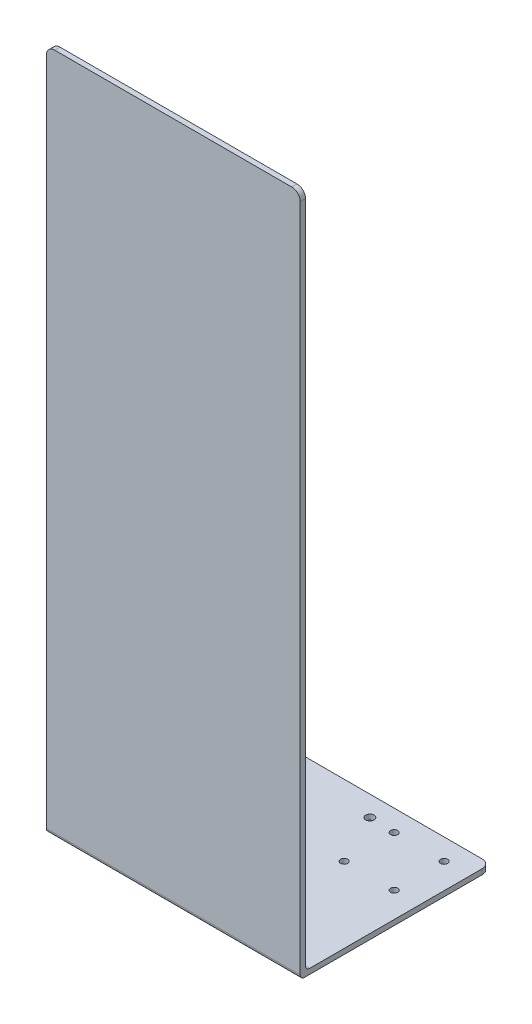
ISO-10303-21;
HEADER;
FILE_DESCRIPTION(('STEP AP214'),'2;1');
FILE_NAME('part.step','',(''),(''),'','','');
FILE_SCHEMA(('AUTOMOTIVE_DESIGN { 1 0 10303 214 1 1 1 1 }'));
ENDSEC;
DATA;
#1=APPLICATION_CONTEXT('core data for automotive mechanical design processes');
#2=APPLICATION_PROTOCOL_DEFINITION('international standard','automotive_design',2000,#1);
#3=PRODUCT_CONTEXT('',#1,'mechanical');
#4=PRODUCT('Part','Part','',(#3));
#5=PRODUCT_RELATED_PRODUCT_CATEGORY('part','',(#4));
#6=PRODUCT_DEFINITION_FORMATION('','',#4);
#7=PRODUCT_DEFINITION_CONTEXT('part definition',#1,'design');
#8=PRODUCT_DEFINITION('design','',#6,#7);
#9=PRODUCT_DEFINITION_SHAPE('','',#8);
#10=(LENGTH_UNIT() NAMED_UNIT(*) SI_UNIT(.MILLI.,.METRE.));
#11=(NAMED_UNIT(*) PLANE_ANGLE_UNIT() SI_UNIT($,.RADIAN.));
#12=(NAMED_UNIT(*) SI_UNIT($,.STERADIAN.) SOLID_ANGLE_UNIT());
#13=UNCERTAINTY_MEASURE_WITH_UNIT(LENGTH_MEASURE(1.E-05),#10,'distance_accuracy_value','');
#14=(GEOMETRIC_REPRESENTATION_CONTEXT(3) GLOBAL_UNCERTAINTY_ASSIGNED_CONTEXT((#13)) GLOBAL_UNIT_ASSIGNED_CONTEXT((#10,
#11,#12)) REPRESENTATION_CONTEXT('',''));
#15=CARTESIAN_POINT('',(0.,0.,0.));
#16=DIRECTION('',(0.,0.,1.));
#17=DIRECTION('',(1.,0.,0.));
#18=AXIS2_PLACEMENT_3D('',#15,#16,#17);
#19=CARTESIAN_POINT('',(-76.2,3.175,57.15));
#20=DIRECTION('',(1.,0.,0.));
#21=DIRECTION('',(0.,0.,-1.));
#22=AXIS2_PLACEMENT_3D('',#19,#20,#21);
#23=PLANE('',#22);
#24=DIRECTION('',(0.,-1.,0.));
#25=VECTOR('',#24,1.);
#26=CARTESIAN_POINT('',(-76.2,3.175,57.15));
#27=LINE('',#26,#25);
#28=CARTESIAN_POINT('',(-76.2,404.495,57.15));
#29=VERTEX_POINT('',#28);
#30=CARTESIAN_POINT('',(-76.2,2.54,57.15));
#31=VERTEX_POINT('',#30);
#32=EDGE_CURVE('E149',#29,#31,#27,.T.);
#33=ORIENTED_EDGE('',*,*,#32,.F.);
#34=DIRECTION('',(0.,0.,1.));
#35=VECTOR('',#34,1.);
#36=CARTESIAN_POINT('',(-76.2,404.495,57.15));
#37=LINE('',#36,#35);
#38=CARTESIAN_POINT('',(-76.2,404.495,53.975));
#39=VERTEX_POINT('',#38);
#40=EDGE_CURVE('E130',#29,#39,#37,.F.);
#41=ORIENTED_EDGE('',*,*,#40,.T.);
#42=DIRECTION('',(0.,-1.,0.));
#43=VECTOR('',#42,1.);
#44=CARTESIAN_POINT('',(-76.2,409.575,53.975));
#45=LINE('',#44,#43);
#46=CARTESIAN_POINT('',(-76.2,5.71500000000003,53.975));
#47=VERTEX_POINT('',#46);
#48=EDGE_CURVE('E123',#39,#47,#45,.T.);
#49=ORIENTED_EDGE('',*,*,#48,.T.);
#50=CARTESIAN_POINT('',(-76.2,5.71500000000003,51.435));
#51=DIRECTION('',(1.,0.,0.));
#52=DIRECTION('',(0.,0.,-1.));
#53=AXIS2_PLACEMENT_3D('',#50,#51,#52);
#54=CIRCLE('',#53,2.54);
#55=CARTESIAN_POINT('',(-76.2,3.175,51.435));
#56=VERTEX_POINT('',#55);
#57=EDGE_CURVE('E127',#47,#56,#54,.T.);
#58=ORIENTED_EDGE('',*,*,#57,.T.);
#59=DIRECTION('',(0.,0.,1.));
#60=VECTOR('',#59,1.);
#61=CARTESIAN_POINT('',(-76.2,3.175,57.15));
#62=LINE('',#61,#60);
#63=CARTESIAN_POINT('',(-76.2,3.175,-52.07));
#64=VERTEX_POINT('',#63);
#65=EDGE_CURVE('E207',#64,#56,#62,.T.);
#66=ORIENTED_EDGE('',*,*,#65,.F.);
#67=DIRECTION('',(0.,-1.,0.));
#68=VECTOR('',#67,1.);
#69=CARTESIAN_POINT('',(-76.2,3.175,-52.07));
#70=LINE('',#69,#68);
#71=CARTESIAN_POINT('',(-76.2,0.,-52.07));
#72=VERTEX_POINT('',#71);
#73=EDGE_CURVE('E177',#64,#72,#70,.T.);
#74=ORIENTED_EDGE('',*,*,#73,.T.);
#75=DIRECTION('',(0.,0.,1.));
#76=VECTOR('',#75,1.);
#77=CARTESIAN_POINT('',(-76.2,0.,57.15));
#78=LINE('',#77,#76);
#79=CARTESIAN_POINT('',(-76.2,0.,54.61));
#80=VERTEX_POINT('',#79);
#81=EDGE_CURVE('E212',#72,#80,#78,.T.);
#82=ORIENTED_EDGE('',*,*,#81,.T.);
#83=CARTESIAN_POINT('',(-76.2,2.54,54.61));
#84=DIRECTION('',(1.,0.,0.));
#85=DIRECTION('',(0.,0.,-1.));
#86=AXIS2_PLACEMENT_3D('',#83,#84,#85);
#87=CIRCLE('',#86,2.54);
#88=EDGE_CURVE('E144',#80,#31,#87,.F.);
#89=ORIENTED_EDGE('',*,*,#88,.T.);
#90=EDGE_LOOP('',(#33,#41,#49,#58,#66,#74,#82,#89));
#91=FACE_BOUND('',#90,.T.);
#92=ADVANCED_FACE('F34',(#91),#23,.F.);
#93=CARTESIAN_POINT('',(76.2,3.175,57.15));
#94=DIRECTION('',(0.,0.,-1.));
#95=DIRECTION('',(-1.,0.,0.));
#96=AXIS2_PLACEMENT_3D('',#93,#94,#95);
#97=PLANE('',#96);
#98=DIRECTION('',(1.,0.,0.));
#99=VECTOR('',#98,1.);
#100=CARTESIAN_POINT('',(-76.2,409.575,57.15));
#101=LINE('',#100,#99);
#102=CARTESIAN_POINT('',(-71.12,409.575,57.15));
#103=VERTEX_POINT('',#102);
#104=CARTESIAN_POINT('',(71.1199999999999,409.575,57.15));
#105=VERTEX_POINT('',#104);
#106=EDGE_CURVE('E225',#103,#105,#101,.T.);
#107=ORIENTED_EDGE('',*,*,#106,.F.);
#108=CARTESIAN_POINT('',(-71.12,404.495,57.15));
#109=DIRECTION('',(0.,0.,-1.));
#110=DIRECTION('',(-1.,0.,0.));
#111=AXIS2_PLACEMENT_3D('',#108,#109,#110);
#112=CIRCLE('',#111,5.08);
#113=EDGE_CURVE('E175',#103,#29,#112,.F.);
#114=ORIENTED_EDGE('',*,*,#113,.T.);
#115=ORIENTED_EDGE('',*,*,#32,.T.);
#116=DIRECTION('',(1.,0.,0.));
#117=VECTOR('',#116,1.);
#118=CARTESIAN_POINT('',(76.2,2.54,57.15));
#119=LINE('',#118,#117);
#120=CARTESIAN_POINT('',(76.2,2.54,57.15));
#121=VERTEX_POINT('',#120);
#122=EDGE_CURVE('E151',#31,#121,#119,.T.);
#123=ORIENTED_EDGE('',*,*,#122,.T.);
#124=DIRECTION('',(0.,-1.,0.));
#125=VECTOR('',#124,1.);
#126=CARTESIAN_POINT('',(76.2,3.175,57.15));
#127=LINE('',#126,#125);
#128=CARTESIAN_POINT('',(76.2,404.495,57.15));
#129=VERTEX_POINT('',#128);
#130=EDGE_CURVE('E153',#129,#121,#127,.T.);
#131=ORIENTED_EDGE('',*,*,#130,.F.);
#132=CARTESIAN_POINT('',(71.12,404.495,57.15));
#133=DIRECTION('',(0.,0.,-1.));
#134=DIRECTION('',(-1.,0.,0.));
#135=AXIS2_PLACEMENT_3D('',#132,#133,#134);
#136=CIRCLE('',#135,5.08);
#137=EDGE_CURVE('E173',#129,#105,#136,.F.);
#138=ORIENTED_EDGE('',*,*,#137,.T.);
#139=EDGE_LOOP('',(#107,#114,#115,#123,#131,#138));
#140=FACE_BOUND('',#139,.T.);
#141=ADVANCED_FACE('F323',(#140),#97,.F.);
#142=CARTESIAN_POINT('',(76.2,3.175,57.15));
#143=DIRECTION('',(-1.,0.,0.));
#144=DIRECTION('',(0.,0.,1.));
#145=AXIS2_PLACEMENT_3D('',#142,#143,#144);
#146=PLANE('',#145);
#147=DIRECTION('',(0.,-1.,0.));
#148=VECTOR('',#147,1.);
#149=CARTESIAN_POINT('',(76.2,409.575,53.975));
#150=LINE('',#149,#148);
#151=CARTESIAN_POINT('',(76.2,404.495,53.975));
#152=VERTEX_POINT('',#151);
#153=CARTESIAN_POINT('',(76.2,5.71500000000003,53.975));
#154=VERTEX_POINT('',#153);
#155=EDGE_CURVE('E134',#152,#154,#150,.T.);
#156=ORIENTED_EDGE('',*,*,#155,.F.);
#157=DIRECTION('',(0.,0.,-1.));
#158=VECTOR('',#157,1.);
#159=CARTESIAN_POINT('',(76.2,404.495,57.15));
#160=LINE('',#159,#158);
#161=EDGE_CURVE('E187',#152,#129,#160,.F.);
#162=ORIENTED_EDGE('',*,*,#161,.T.);
#163=ORIENTED_EDGE('',*,*,#130,.T.);
#164=CARTESIAN_POINT('',(76.2,2.54,54.61));
#165=DIRECTION('',(-1.,0.,0.));
#166=DIRECTION('',(0.,0.,1.));
#167=AXIS2_PLACEMENT_3D('',#164,#165,#166);
#168=CIRCLE('',#167,2.54);
#169=CARTESIAN_POINT('',(76.2,0.,54.61));
#170=VERTEX_POINT('',#169);
#171=EDGE_CURVE('E159',#121,#170,#168,.F.);
#172=ORIENTED_EDGE('',*,*,#171,.T.);
#173=DIRECTION('',(0.,0.,-1.));
#174=VECTOR('',#173,1.);
#175=CARTESIAN_POINT('',(76.2,0.,57.15));
#176=LINE('',#175,#174);
#177=CARTESIAN_POINT('',(76.2,0.,-52.07));
#178=VERTEX_POINT('',#177);
#179=EDGE_CURVE('E208',#170,#178,#176,.T.);
#180=ORIENTED_EDGE('',*,*,#179,.T.);
#181=DIRECTION('',(0.,-1.,0.));
#182=VECTOR('',#181,1.);
#183=CARTESIAN_POINT('',(76.2,3.175,-52.07));
#184=LINE('',#183,#182);
#185=CARTESIAN_POINT('',(76.2,3.175,-52.07));
#186=VERTEX_POINT('',#185);
#187=EDGE_CURVE('E185',#178,#186,#184,.F.);
#188=ORIENTED_EDGE('',*,*,#187,.T.);
#189=DIRECTION('',(0.,0.,-1.));
#190=VECTOR('',#189,1.);
#191=CARTESIAN_POINT('',(76.2,3.175,57.15));
#192=LINE('',#191,#190);
#193=CARTESIAN_POINT('',(76.2,3.175,51.435));
#194=VERTEX_POINT('',#193);
#195=EDGE_CURVE('E210',#194,#186,#192,.T.);
#196=ORIENTED_EDGE('',*,*,#195,.F.);
#197=CARTESIAN_POINT('',(76.2,5.71500000000003,51.435));
#198=DIRECTION('',(-1.,0.,0.));
#199=DIRECTION('',(0.,0.,1.));
#200=AXIS2_PLACEMENT_3D('',#197,#198,#199);
#201=CIRCLE('',#200,2.54);
#202=EDGE_CURVE('E143',#194,#154,#201,.T.);
#203=ORIENTED_EDGE('',*,*,#202,.T.);
#204=EDGE_LOOP('',(#156,#162,#163,#172,#180,#188,#196,#203));
#205=FACE_BOUND('',#204,.T.);
#206=ADVANCED_FACE('F329',(#205),#146,.F.);
#207=CARTESIAN_POINT('',(76.2,3.175,-57.15));
#208=DIRECTION('',(0.,0.,1.));
#209=DIRECTION('',(1.,0.,0.));
#210=AXIS2_PLACEMENT_3D('',#207,#208,#209);
#211=PLANE('',#210);
#212=DIRECTION('',(-1.,0.,0.));
#213=VECTOR('',#212,1.);
#214=CARTESIAN_POINT('',(76.2,0.,-57.15));
#215=LINE('',#214,#213);
#216=CARTESIAN_POINT('',(71.12,0.,-57.15));
#217=VERTEX_POINT('',#216);
#218=CARTESIAN_POINT('',(-71.12,0.,-57.15));
#219=VERTEX_POINT('',#218);
#220=EDGE_CURVE('E199',#217,#219,#215,.T.);
#221=ORIENTED_EDGE('',*,*,#220,.T.);
#222=DIRECTION('',(0.,-1.,0.));
#223=VECTOR('',#222,1.);
#224=CARTESIAN_POINT('',(-71.12,3.175,-57.15));
#225=LINE('',#224,#223);
#226=CARTESIAN_POINT('',(-71.12,3.175,-57.15));
#227=VERTEX_POINT('',#226);
#228=EDGE_CURVE('E49',#219,#227,#225,.F.);
#229=ORIENTED_EDGE('',*,*,#228,.T.);
#230=DIRECTION('',(-1.,0.,0.));
#231=VECTOR('',#230,1.);
#232=CARTESIAN_POINT('',(76.2,3.175,-57.15));
#233=LINE('',#232,#231);
#234=CARTESIAN_POINT('',(71.12,3.175,-57.15));
#235=VERTEX_POINT('',#234);
#236=EDGE_CURVE('E200',#235,#227,#233,.T.);
#237=ORIENTED_EDGE('',*,*,#236,.F.);
#238=DIRECTION('',(0.,-1.,0.));
#239=VECTOR('',#238,1.);
#240=CARTESIAN_POINT('',(71.12,3.175,-57.15));
#241=LINE('',#240,#239);
#242=EDGE_CURVE('E193',#235,#217,#241,.T.);
#243=ORIENTED_EDGE('',*,*,#242,.T.);
#244=EDGE_LOOP('',(#221,#229,#237,#243));
#245=FACE_BOUND('',#244,.T.);
#246=ADVANCED_FACE('F198',(#245),#211,.F.);
#247=CARTESIAN_POINT('',(0.,3.175,0.));
#248=DIRECTION('',(0.,1.,0.));
#249=DIRECTION('',(0.,0.,1.));
#250=AXIS2_PLACEMENT_3D('',#247,#248,#249);
#251=PLANE('',#250);
#252=CARTESIAN_POINT('',(30.9880000000026,3.17500000000537,-44.45));
#253=DIRECTION('',(0.,1.,0.));
#254=DIRECTION('',(0.,0.,1.));
#255=AXIS2_PLACEMENT_3D('',#252,#253,#254);
#256=CIRCLE('',#255,2.159);
#257=CARTESIAN_POINT('',(30.9880000000026,3.17500000000537,-42.291));
#258=VERTEX_POINT('',#257);
#259=EDGE_CURVE('E247',#258,#258,#256,.T.);
#260=ORIENTED_EDGE('',*,*,#259,.F.);
#261=EDGE_LOOP('',(#260));
#262=FACE_BOUND('',#261,.T.);
#263=CARTESIAN_POINT('',(15.8749999999996,3.17500000000137,37.465));
#264=DIRECTION('',(0.,1.,0.));
#265=DIRECTION('',(0.,0.,1.));
#266=AXIS2_PLACEMENT_3D('',#263,#264,#265);
#267=CIRCLE('',#266,2.54);
#268=CARTESIAN_POINT('',(15.8749999999996,3.17500000000137,40.005));
#269=VERTEX_POINT('',#268);
#270=EDGE_CURVE('E254',#269,#269,#267,.T.);
#271=ORIENTED_EDGE('',*,*,#270,.F.);
#272=EDGE_LOOP('',(#271));
#273=FACE_BOUND('',#272,.T.);
#274=CARTESIAN_POINT('',(-66.6750000000018,3.17500000000914,37.465));
#275=DIRECTION('',(0.,1.,0.));
#276=DIRECTION('',(0.,0.,1.));
#277=AXIS2_PLACEMENT_3D('',#274,#275,#276);
#278=CIRCLE('',#277,2.54000000000001);
#279=CARTESIAN_POINT('',(-66.6750000000018,3.17500000000914,40.005));
#280=VERTEX_POINT('',#279);
#281=EDGE_CURVE('E235',#280,#280,#278,.T.);
#282=ORIENTED_EDGE('',*,*,#281,.F.);
#283=EDGE_LOOP('',(#282));
#284=FACE_BOUND('',#283,.T.);
#285=CARTESIAN_POINT('',(15.8749999999995,3.17500000000387,-44.958));
#286=DIRECTION('',(0.,1.,0.));
#287=DIRECTION('',(0.,0.,1.));
#288=AXIS2_PLACEMENT_3D('',#285,#286,#287);
#289=CIRCLE('',#288,2.54);
#290=CARTESIAN_POINT('',(15.8749999999995,3.17500000000387,-42.418));
#291=VERTEX_POINT('',#290);
#292=EDGE_CURVE('E242',#291,#291,#289,.T.);
#293=ORIENTED_EDGE('',*,*,#292,.F.);
#294=EDGE_LOOP('',(#293));
#295=FACE_BOUND('',#294,.T.);
#296=CARTESIAN_POINT('',(60.9386025101175,3.17500000000739,-44.4600000000001));
#297=DIRECTION('',(0.,1.,0.));
#298=DIRECTION('',(0.,0.,1.));
#299=AXIS2_PLACEMENT_3D('',#296,#297,#298);
#300=CIRCLE('',#299,2.14999999999998);
#301=CARTESIAN_POINT('',(60.9386025101175,3.17500000000739,-42.3100000000001));
#302=VERTEX_POINT('',#301);
#303=EDGE_CURVE('E277',#302,#302,#300,.T.);
#304=ORIENTED_EDGE('',*,*,#303,.F.);
#305=EDGE_LOOP('',(#304));
#306=FACE_BOUND('',#305,.T.);
#307=CARTESIAN_POINT('',(60.9600000000001,3.17500000000201,-14.4780000000097));
#308=DIRECTION('',(0.,1.,0.));
#309=DIRECTION('',(0.,0.,1.));
#310=AXIS2_PLACEMENT_3D('',#307,#308,#309);
#311=CIRCLE('',#310,2.15899999999999);
#312=CARTESIAN_POINT('',(60.9600000000001,3.17500000000201,-12.3190000000097));
#313=VERTEX_POINT('',#312);
#314=EDGE_CURVE('E271',#313,#313,#311,.T.);
#315=ORIENTED_EDGE('',*,*,#314,.F.);
#316=EDGE_LOOP('',(#315));
#317=FACE_BOUND('',#316,.T.);
#318=CARTESIAN_POINT('',(30.938602510105,3.1750000000029,-14.478));
#319=DIRECTION('',(0.,1.,0.));
#320=DIRECTION('',(0.,0.,1.));
#321=AXIS2_PLACEMENT_3D('',#318,#319,#320);
#322=CIRCLE('',#321,2.159);
#323=CARTESIAN_POINT('',(30.938602510105,3.1750000000029,-12.319));
#324=VERTEX_POINT('',#323);
#325=EDGE_CURVE('E265',#324,#324,#322,.T.);
#326=ORIENTED_EDGE('',*,*,#325,.F.);
#327=EDGE_LOOP('',(#326));
#328=FACE_BOUND('',#327,.T.);
#329=CARTESIAN_POINT('',(-66.6750000000005,3.17500000000326,-45.085));
#330=DIRECTION('',(0.,1.,0.));
#331=DIRECTION('',(0.,0.,1.));
#332=AXIS2_PLACEMENT_3D('',#329,#330,#331);
#333=CIRCLE('',#332,2.53999999999998);
#334=CARTESIAN_POINT('',(-66.6750000000005,3.17500000000326,-42.545));
#335=VERTEX_POINT('',#334);
#336=EDGE_CURVE('E259',#335,#335,#333,.T.);
#337=ORIENTED_EDGE('',*,*,#336,.F.);
#338=EDGE_LOOP('',(#337));
#339=FACE_BOUND('',#338,.T.);
#340=CARTESIAN_POINT('',(-25.4,3.17500000000104,-3.80999999999998));
#341=DIRECTION('',(0.,1.,0.));
#342=DIRECTION('',(0.,0.,1.));
#343=AXIS2_PLACEMENT_3D('',#340,#341,#342);
#344=CIRCLE('',#343,30.988);
#345=CARTESIAN_POINT('',(-25.4,3.17500000000104,27.178));
#346=VERTEX_POINT('',#345);
#347=EDGE_CURVE('E229',#346,#346,#344,.T.);
#348=ORIENTED_EDGE('',*,*,#347,.F.);
#349=EDGE_LOOP('',(#348));
#350=FACE_BOUND('',#349,.T.);
#351=ORIENTED_EDGE('',*,*,#236,.T.);
#352=CARTESIAN_POINT('',(-71.12,3.175,-52.07));
#353=DIRECTION('',(0.,1.,0.));
#354=DIRECTION('',(0.,0.,1.));
#355=AXIS2_PLACEMENT_3D('',#352,#353,#354);
#356=CIRCLE('',#355,5.08);
#357=EDGE_CURVE('E11',#227,#64,#356,.T.);
#358=ORIENTED_EDGE('',*,*,#357,.T.);
#359=ORIENTED_EDGE('',*,*,#65,.T.);
#360=DIRECTION('',(-1.,0.,0.));
#361=VECTOR('',#360,1.);
#362=CARTESIAN_POINT('',(0.,3.175,51.435));
#363=LINE('',#362,#361);
#364=EDGE_CURVE('E142',#56,#194,#363,.F.);
#365=ORIENTED_EDGE('',*,*,#364,.T.);
#366=ORIENTED_EDGE('',*,*,#195,.T.);
#367=CARTESIAN_POINT('',(71.12,3.175,-52.07));
#368=DIRECTION('',(0.,1.,0.));
#369=DIRECTION('',(0.,0.,1.));
#370=AXIS2_PLACEMENT_3D('',#367,#368,#369);
#371=CIRCLE('',#370,5.08);
#372=EDGE_CURVE('E42',#186,#235,#371,.T.);
#373=ORIENTED_EDGE('',*,*,#372,.T.);
#374=EDGE_LOOP('',(#351,#358,#359,#365,#366,#373));
#375=FACE_BOUND('',#374,.T.);
#376=ADVANCED_FACE('F293',(#262,#273,#284,#295,#306,#317,#328,#339,#350,#375),#251,.T.);
#377=CARTESIAN_POINT('',(0.,0.,0.));
#378=DIRECTION('',(0.,1.,0.));
#379=DIRECTION('',(0.,0.,1.));
#380=AXIS2_PLACEMENT_3D('',#377,#378,#379);
#381=PLANE('',#380);
#382=CARTESIAN_POINT('',(30.9880000000026,4.32986979603811E-12,-44.45));
#383=DIRECTION('',(0.,1.,0.));
#384=DIRECTION('',(0.,0.,1.));
#385=AXIS2_PLACEMENT_3D('',#382,#383,#384);
#386=CIRCLE('',#385,2.159);
#387=CARTESIAN_POINT('',(30.9880000000026,4.32986979603811E-12,-42.291));
#388=VERTEX_POINT('',#387);
#389=EDGE_CURVE('E250',#388,#388,#386,.T.);
#390=ORIENTED_EDGE('',*,*,#389,.T.);
#391=EDGE_LOOP('',(#390));
#392=FACE_BOUND('',#391,.T.);
#393=CARTESIAN_POINT('',(15.8749999999996,3.33066907387547E-13,37.465));
#394=DIRECTION('',(0.,1.,0.));
#395=DIRECTION('',(0.,0.,1.));
#396=AXIS2_PLACEMENT_3D('',#393,#394,#395);
#397=CIRCLE('',#396,2.54);
#398=CARTESIAN_POINT('',(15.8749999999996,3.33066907387547E-13,40.005));
#399=VERTEX_POINT('',#398);
#400=EDGE_CURVE('E239',#399,#399,#397,.T.);
#401=ORIENTED_EDGE('',*,*,#400,.T.);
#402=EDGE_LOOP('',(#401));
#403=FACE_BOUND('',#402,.T.);
#404=CARTESIAN_POINT('',(-66.6750000000018,8.10462807976364E-12,37.465));
#405=DIRECTION('',(0.,1.,0.));
#406=DIRECTION('',(0.,0.,1.));
#407=AXIS2_PLACEMENT_3D('',#404,#405,#406);
#408=CIRCLE('',#407,2.54000000000001);
#409=CARTESIAN_POINT('',(-66.6750000000018,8.10462807976364E-12,40.005));
#410=VERTEX_POINT('',#409);
#411=EDGE_CURVE('E238',#410,#410,#408,.T.);
#412=ORIENTED_EDGE('',*,*,#411,.T.);
#413=EDGE_LOOP('',(#412));
#414=FACE_BOUND('',#413,.T.);
#415=CARTESIAN_POINT('',(15.8749999999995,2.83106871279415E-12,-44.958));
#416=DIRECTION('',(0.,1.,0.));
#417=DIRECTION('',(0.,0.,1.));
#418=AXIS2_PLACEMENT_3D('',#415,#416,#417);
#419=CIRCLE('',#418,2.54);
#420=CARTESIAN_POINT('',(15.8749999999995,2.83106871279415E-12,-42.418));
#421=VERTEX_POINT('',#420);
#422=EDGE_CURVE('E232',#421,#421,#419,.T.);
#423=ORIENTED_EDGE('',*,*,#422,.T.);
#424=EDGE_LOOP('',(#423));
#425=FACE_BOUND('',#424,.T.);
#426=CARTESIAN_POINT('',(60.9386025101175,6.35602681597902E-12,-44.4600000000001));
#427=DIRECTION('',(0.,1.,0.));
#428=DIRECTION('',(0.,0.,1.));
#429=AXIS2_PLACEMENT_3D('',#426,#427,#428);
#430=CIRCLE('',#429,2.14999999999998);
#431=CARTESIAN_POINT('',(60.9386025101175,6.35602681597902E-12,-42.3100000000001));
#432=VERTEX_POINT('',#431);
#433=EDGE_CURVE('E251',#432,#432,#430,.T.);
#434=ORIENTED_EDGE('',*,*,#433,.T.);
#435=EDGE_LOOP('',(#434));
#436=FACE_BOUND('',#435,.T.);
#437=CARTESIAN_POINT('',(60.9600000000001,9.71445146547012E-13,-14.4780000000097));
#438=DIRECTION('',(0.,1.,0.));
#439=DIRECTION('',(0.,0.,1.));
#440=AXIS2_PLACEMENT_3D('',#437,#438,#439);
#441=CIRCLE('',#440,2.15899999999999);
#442=CARTESIAN_POINT('',(60.9600000000001,9.71445146547012E-13,-12.3190000000097));
#443=VERTEX_POINT('',#442);
#444=EDGE_CURVE('E274',#443,#443,#441,.T.);
#445=ORIENTED_EDGE('',*,*,#444,.T.);
#446=EDGE_LOOP('',(#445));
#447=FACE_BOUND('',#446,.T.);
#448=CARTESIAN_POINT('',(30.938602510105,1.85962356624714E-12,-14.478));
#449=DIRECTION('',(0.,1.,0.));
#450=DIRECTION('',(0.,0.,1.));
#451=AXIS2_PLACEMENT_3D('',#448,#449,#450);
#452=CIRCLE('',#451,2.159);
#453=CARTESIAN_POINT('',(30.938602510105,1.85962356624714E-12,-12.319));
#454=VERTEX_POINT('',#453);
#455=EDGE_CURVE('E268',#454,#454,#452,.T.);
#456=ORIENTED_EDGE('',*,*,#455,.T.);
#457=EDGE_LOOP('',(#456));
#458=FACE_BOUND('',#457,.T.);
#459=CARTESIAN_POINT('',(-66.6750000000005,2.22044604925031E-12,-45.085));
#460=DIRECTION('',(0.,1.,0.));
#461=DIRECTION('',(0.,0.,1.));
#462=AXIS2_PLACEMENT_3D('',#459,#460,#461);
#463=CIRCLE('',#462,2.53999999999998);
#464=CARTESIAN_POINT('',(-66.6750000000005,2.22044604925031E-12,-42.545));
#465=VERTEX_POINT('',#464);
#466=EDGE_CURVE('E262',#465,#465,#463,.T.);
#467=ORIENTED_EDGE('',*,*,#466,.T.);
#468=EDGE_LOOP('',(#467));
#469=FACE_BOUND('',#468,.T.);
#470=CARTESIAN_POINT('',(-25.4,0.,-3.80999999999998));
#471=DIRECTION('',(0.,1.,0.));
#472=DIRECTION('',(0.,0.,1.));
#473=AXIS2_PLACEMENT_3D('',#470,#471,#472);
#474=CIRCLE('',#473,30.988);
#475=CARTESIAN_POINT('',(-25.4,0.,27.178));
#476=VERTEX_POINT('',#475);
#477=EDGE_CURVE('E228',#476,#476,#474,.T.);
#478=ORIENTED_EDGE('',*,*,#477,.T.);
#479=EDGE_LOOP('',(#478));
#480=FACE_BOUND('',#479,.T.);
#481=ORIENTED_EDGE('',*,*,#81,.F.);
#482=CARTESIAN_POINT('',(-71.12,0.,-52.07));
#483=DIRECTION('',(0.,1.,0.));
#484=DIRECTION('',(0.,0.,1.));
#485=AXIS2_PLACEMENT_3D('',#482,#483,#484);
#486=CIRCLE('',#485,5.08);
#487=EDGE_CURVE('E191',#72,#219,#486,.F.);
#488=ORIENTED_EDGE('',*,*,#487,.T.);
#489=ORIENTED_EDGE('',*,*,#220,.F.);
#490=CARTESIAN_POINT('',(71.12,0.,-52.07));
#491=DIRECTION('',(0.,1.,0.));
#492=DIRECTION('',(0.,0.,1.));
#493=AXIS2_PLACEMENT_3D('',#490,#491,#492);
#494=CIRCLE('',#493,5.08);
#495=EDGE_CURVE('E189',#217,#178,#494,.F.);
#496=ORIENTED_EDGE('',*,*,#495,.T.);
#497=ORIENTED_EDGE('',*,*,#179,.F.);
#498=DIRECTION('',(1.,0.,0.));
#499=VECTOR('',#498,1.);
#500=CARTESIAN_POINT('',(0.,0.,54.61));
#501=LINE('',#500,#499);
#502=EDGE_CURVE('E161',#170,#80,#501,.F.);
#503=ORIENTED_EDGE('',*,*,#502,.T.);
#504=EDGE_LOOP('',(#481,#488,#489,#496,#497,#503));
#505=FACE_BOUND('',#504,.T.);
#506=ADVANCED_FACE('F204',(#392,#403,#414,#425,#436,#447,#458,#469,#480,#505),#381,.F.);
#507=CARTESIAN_POINT('',(-76.2,409.575,53.975));
#508=DIRECTION('',(0.,0.,1.));
#509=DIRECTION('',(1.,0.,0.));
#510=AXIS2_PLACEMENT_3D('',#507,#508,#509);
#511=PLANE('',#510);
#512=ORIENTED_EDGE('',*,*,#48,.F.);
#513=CARTESIAN_POINT('',(-71.12,404.495,53.975));
#514=DIRECTION('',(0.,0.,1.));
#515=DIRECTION('',(1.,0.,0.));
#516=AXIS2_PLACEMENT_3D('',#513,#514,#515);
#517=CIRCLE('',#516,5.08);
#518=CARTESIAN_POINT('',(-71.12,409.575,53.975));
#519=VERTEX_POINT('',#518);
#520=EDGE_CURVE('E183',#39,#519,#517,.F.);
#521=ORIENTED_EDGE('',*,*,#520,.T.);
#522=DIRECTION('',(-1.,0.,0.));
#523=VECTOR('',#522,1.);
#524=CARTESIAN_POINT('',(-76.2,409.575,53.975));
#525=LINE('',#524,#523);
#526=CARTESIAN_POINT('',(71.1199999999999,409.575,53.975));
#527=VERTEX_POINT('',#526);
#528=EDGE_CURVE('E135',#527,#519,#525,.T.);
#529=ORIENTED_EDGE('',*,*,#528,.F.);
#530=CARTESIAN_POINT('',(71.12,404.495,53.975));
#531=DIRECTION('',(0.,0.,1.));
#532=DIRECTION('',(1.,0.,0.));
#533=AXIS2_PLACEMENT_3D('',#530,#531,#532);
#534=CIRCLE('',#533,5.08);
#535=EDGE_CURVE('E181',#527,#152,#534,.F.);
#536=ORIENTED_EDGE('',*,*,#535,.T.);
#537=ORIENTED_EDGE('',*,*,#155,.T.);
#538=DIRECTION('',(-1.,0.,0.));
#539=VECTOR('',#538,1.);
#540=CARTESIAN_POINT('',(-76.2,5.71500000000003,53.975));
#541=LINE('',#540,#539);
#542=EDGE_CURVE('E141',#154,#47,#541,.T.);
#543=ORIENTED_EDGE('',*,*,#542,.T.);
#544=EDGE_LOOP('',(#512,#521,#529,#536,#537,#543));
#545=FACE_BOUND('',#544,.T.);
#546=ADVANCED_FACE('F146',(#545),#511,.F.);
#547=CARTESIAN_POINT('',(0.,409.575,0.));
#548=DIRECTION('',(0.,-1.,0.));
#549=DIRECTION('',(0.,0.,-1.));
#550=AXIS2_PLACEMENT_3D('',#547,#548,#549);
#551=PLANE('',#550);
#552=ORIENTED_EDGE('',*,*,#528,.T.);
#553=DIRECTION('',(0.,0.,1.));
#554=VECTOR('',#553,1.);
#555=CARTESIAN_POINT('',(-71.12,409.575,0.));
#556=LINE('',#555,#554);
#557=EDGE_CURVE('E170',#519,#103,#556,.T.);
#558=ORIENTED_EDGE('',*,*,#557,.T.);
#559=ORIENTED_EDGE('',*,*,#106,.T.);
#560=DIRECTION('',(0.,0.,-1.));
#561=VECTOR('',#560,1.);
#562=CARTESIAN_POINT('',(71.12,409.575,0.));
#563=LINE('',#562,#561);
#564=EDGE_CURVE('E167',#105,#527,#563,.T.);
#565=ORIENTED_EDGE('',*,*,#564,.T.);
#566=EDGE_LOOP('',(#552,#558,#559,#565));
#567=FACE_BOUND('',#566,.T.);
#568=ADVANCED_FACE('F337',(#567),#551,.F.);
#569=CARTESIAN_POINT('',(-76.2,5.71500000000003,51.435));
#570=DIRECTION('',(-1.,0.,0.));
#571=DIRECTION('',(0.,0.,1.));
#572=AXIS2_PLACEMENT_3D('',#569,#570,#571);
#573=CYLINDRICAL_SURFACE('',#572,2.54);
#574=ORIENTED_EDGE('',*,*,#202,.F.);
#575=ORIENTED_EDGE('',*,*,#364,.F.);
#576=ORIENTED_EDGE('',*,*,#57,.F.);
#577=ORIENTED_EDGE('',*,*,#542,.F.);
#578=EDGE_LOOP('',(#574,#575,#576,#577));
#579=FACE_BOUND('',#578,.T.);
#580=ADVANCED_FACE('F140',(#579),#573,.F.);
#581=CARTESIAN_POINT('',(76.2,2.54,54.61));
#582=DIRECTION('',(1.,0.,0.));
#583=DIRECTION('',(0.,0.,-1.));
#584=AXIS2_PLACEMENT_3D('',#581,#582,#583);
#585=CYLINDRICAL_SURFACE('',#584,2.54);
#586=ORIENTED_EDGE('',*,*,#88,.F.);
#587=ORIENTED_EDGE('',*,*,#502,.F.);
#588=ORIENTED_EDGE('',*,*,#171,.F.);
#589=ORIENTED_EDGE('',*,*,#122,.F.);
#590=EDGE_LOOP('',(#586,#587,#588,#589));
#591=FACE_BOUND('',#590,.T.);
#592=ADVANCED_FACE('F336',(#591),#585,.T.);
#593=CARTESIAN_POINT('',(-71.12,404.495,0.));
#594=DIRECTION('',(0.,0.,1.));
#595=DIRECTION('',(1.,0.,0.));
#596=AXIS2_PLACEMENT_3D('',#593,#594,#595);
#597=CYLINDRICAL_SURFACE('',#596,5.08);
#598=ORIENTED_EDGE('',*,*,#520,.F.);
#599=ORIENTED_EDGE('',*,*,#40,.F.);
#600=ORIENTED_EDGE('',*,*,#113,.F.);
#601=ORIENTED_EDGE('',*,*,#557,.F.);
#602=EDGE_LOOP('',(#598,#599,#600,#601));
#603=FACE_BOUND('',#602,.T.);
#604=ADVANCED_FACE('F340',(#603),#597,.T.);
#605=CARTESIAN_POINT('',(71.12,404.495,0.));
#606=DIRECTION('',(0.,0.,-1.));
#607=DIRECTION('',(-1.,0.,0.));
#608=AXIS2_PLACEMENT_3D('',#605,#606,#607);
#609=CYLINDRICAL_SURFACE('',#608,5.08);
#610=ORIENTED_EDGE('',*,*,#137,.F.);
#611=ORIENTED_EDGE('',*,*,#161,.F.);
#612=ORIENTED_EDGE('',*,*,#535,.F.);
#613=ORIENTED_EDGE('',*,*,#564,.F.);
#614=EDGE_LOOP('',(#610,#611,#612,#613));
#615=FACE_BOUND('',#614,.T.);
#616=ADVANCED_FACE('F344',(#615),#609,.T.);
#617=CARTESIAN_POINT('',(-71.12,3.175,-52.07));
#618=DIRECTION('',(0.,-1.,0.));
#619=DIRECTION('',(0.,0.,-1.));
#620=AXIS2_PLACEMENT_3D('',#617,#618,#619);
#621=CYLINDRICAL_SURFACE('',#620,5.08);
#622=ORIENTED_EDGE('',*,*,#357,.F.);
#623=ORIENTED_EDGE('',*,*,#228,.F.);
#624=ORIENTED_EDGE('',*,*,#487,.F.);
#625=ORIENTED_EDGE('',*,*,#73,.F.);
#626=EDGE_LOOP('',(#622,#623,#624,#625));
#627=FACE_BOUND('',#626,.T.);
#628=ADVANCED_FACE('F318',(#627),#621,.T.);
#629=CARTESIAN_POINT('',(71.12,3.175,-52.07));
#630=DIRECTION('',(0.,-1.,0.));
#631=DIRECTION('',(0.,0.,-1.));
#632=AXIS2_PLACEMENT_3D('',#629,#630,#631);
#633=CYLINDRICAL_SURFACE('',#632,5.08);
#634=ORIENTED_EDGE('',*,*,#372,.F.);
#635=ORIENTED_EDGE('',*,*,#187,.F.);
#636=ORIENTED_EDGE('',*,*,#495,.F.);
#637=ORIENTED_EDGE('',*,*,#242,.F.);
#638=EDGE_LOOP('',(#634,#635,#636,#637));
#639=FACE_BOUND('',#638,.T.);
#640=ADVANCED_FACE('F36',(#639),#633,.T.);
#641=CARTESIAN_POINT('',(-25.4,0.,-3.80999999999998));
#642=DIRECTION('',(0.,1.,0.));
#643=DIRECTION('',(0.,0.,1.));
#644=AXIS2_PLACEMENT_3D('',#641,#642,#643);
#645=CYLINDRICAL_SURFACE('',#644,30.988);
#646=ORIENTED_EDGE('',*,*,#477,.F.);
#647=EDGE_LOOP('',(#646));
#648=FACE_BOUND('',#647,.T.);
#649=ORIENTED_EDGE('',*,*,#347,.T.);
#650=EDGE_LOOP('',(#649));
#651=FACE_BOUND('',#650,.T.);
#652=ADVANCED_FACE('F306',(#648,#651),#645,.F.);
#653=CARTESIAN_POINT('',(-66.6750000000005,2.22044604925031E-12,-45.085));
#654=DIRECTION('',(0.,1.,0.));
#655=DIRECTION('',(0.,0.,1.));
#656=AXIS2_PLACEMENT_3D('',#653,#654,#655);
#657=CYLINDRICAL_SURFACE('',#656,2.53999999999998);
#658=ORIENTED_EDGE('',*,*,#466,.F.);
#659=EDGE_LOOP('',(#658));
#660=FACE_BOUND('',#659,.T.);
#661=ORIENTED_EDGE('',*,*,#336,.T.);
#662=EDGE_LOOP('',(#661));
#663=FACE_BOUND('',#662,.T.);
#664=ADVANCED_FACE('F308',(#660,#663),#657,.F.);
#665=CARTESIAN_POINT('',(30.938602510105,1.85962356624714E-12,-14.478));
#666=DIRECTION('',(0.,1.,0.));
#667=DIRECTION('',(0.,0.,1.));
#668=AXIS2_PLACEMENT_3D('',#665,#666,#667);
#669=CYLINDRICAL_SURFACE('',#668,2.159);
#670=ORIENTED_EDGE('',*,*,#455,.F.);
#671=EDGE_LOOP('',(#670));
#672=FACE_BOUND('',#671,.T.);
#673=ORIENTED_EDGE('',*,*,#325,.T.);
#674=EDGE_LOOP('',(#673));
#675=FACE_BOUND('',#674,.T.);
#676=ADVANCED_FACE('F315',(#672,#675),#669,.F.);
#677=CARTESIAN_POINT('',(60.9600000000001,9.71445146547012E-13,-14.4780000000097));
#678=DIRECTION('',(0.,1.,0.));
#679=DIRECTION('',(0.,0.,1.));
#680=AXIS2_PLACEMENT_3D('',#677,#678,#679);
#681=CYLINDRICAL_SURFACE('',#680,2.15899999999999);
#682=ORIENTED_EDGE('',*,*,#444,.F.);
#683=EDGE_LOOP('',(#682));
#684=FACE_BOUND('',#683,.T.);
#685=ORIENTED_EDGE('',*,*,#314,.T.);
#686=EDGE_LOOP('',(#685));
#687=FACE_BOUND('',#686,.T.);
#688=ADVANCED_FACE('F289',(#684,#687),#681,.F.);
#689=CARTESIAN_POINT('',(60.9386025101175,6.35602681597902E-12,-44.4600000000001));
#690=DIRECTION('',(0.,1.,0.));
#691=DIRECTION('',(0.,0.,1.));
#692=AXIS2_PLACEMENT_3D('',#689,#690,#691);
#693=CYLINDRICAL_SURFACE('',#692,2.14999999999998);
#694=ORIENTED_EDGE('',*,*,#433,.F.);
#695=EDGE_LOOP('',(#694));
#696=FACE_BOUND('',#695,.T.);
#697=ORIENTED_EDGE('',*,*,#303,.T.);
#698=EDGE_LOOP('',(#697));
#699=FACE_BOUND('',#698,.T.);
#700=ADVANCED_FACE('F285',(#696,#699),#693,.F.);
#701=CARTESIAN_POINT('',(15.8749999999995,2.83106871279415E-12,-44.958));
#702=DIRECTION('',(0.,1.,0.));
#703=DIRECTION('',(0.,0.,1.));
#704=AXIS2_PLACEMENT_3D('',#701,#702,#703);
#705=CYLINDRICAL_SURFACE('',#704,2.54);
#706=ORIENTED_EDGE('',*,*,#422,.F.);
#707=EDGE_LOOP('',(#706));
#708=FACE_BOUND('',#707,.T.);
#709=ORIENTED_EDGE('',*,*,#292,.T.);
#710=EDGE_LOOP('',(#709));
#711=FACE_BOUND('',#710,.T.);
#712=ADVANCED_FACE('F288',(#708,#711),#705,.F.);
#713=CARTESIAN_POINT('',(-66.6750000000018,8.10462807976364E-12,37.465));
#714=DIRECTION('',(0.,1.,0.));
#715=DIRECTION('',(0.,0.,1.));
#716=AXIS2_PLACEMENT_3D('',#713,#714,#715);
#717=CYLINDRICAL_SURFACE('',#716,2.54000000000001);
#718=ORIENTED_EDGE('',*,*,#411,.F.);
#719=EDGE_LOOP('',(#718));
#720=FACE_BOUND('',#719,.T.);
#721=ORIENTED_EDGE('',*,*,#281,.T.);
#722=EDGE_LOOP('',(#721));
#723=FACE_BOUND('',#722,.T.);
#724=ADVANCED_FACE('F457',(#720,#723),#717,.F.);
#725=CARTESIAN_POINT('',(15.8749999999996,3.33066907387547E-13,37.465));
#726=DIRECTION('',(0.,1.,0.));
#727=DIRECTION('',(0.,0.,1.));
#728=AXIS2_PLACEMENT_3D('',#725,#726,#727);
#729=CYLINDRICAL_SURFACE('',#728,2.54);
#730=ORIENTED_EDGE('',*,*,#400,.F.);
#731=EDGE_LOOP('',(#730));
#732=FACE_BOUND('',#731,.T.);
#733=ORIENTED_EDGE('',*,*,#270,.T.);
#734=EDGE_LOOP('',(#733));
#735=FACE_BOUND('',#734,.T.);
#736=ADVANCED_FACE('F467',(#732,#735),#729,.F.);
#737=CARTESIAN_POINT('',(30.9880000000026,4.32986979603811E-12,-44.45));
#738=DIRECTION('',(0.,1.,0.));
#739=DIRECTION('',(0.,0.,1.));
#740=AXIS2_PLACEMENT_3D('',#737,#738,#739);
#741=CYLINDRICAL_SURFACE('',#740,2.159);
#742=ORIENTED_EDGE('',*,*,#389,.F.);
#743=EDGE_LOOP('',(#742));
#744=FACE_BOUND('',#743,.T.);
#745=ORIENTED_EDGE('',*,*,#259,.T.);
#746=EDGE_LOOP('',(#745));
#747=FACE_BOUND('',#746,.T.);
#748=ADVANCED_FACE('F476',(#744,#747),#741,.F.);
#749=CLOSED_SHELL('',(#92,#141,#206,#246,#376,#506,#546,#568,#580,#592,#604,#616,#628,#640,#652,
#664,#676,#688,#700,#712,#724,#736,#748));
#750=MANIFOLD_SOLID_BREP('B2',#749);
#751=ADVANCED_BREP_SHAPE_REPRESENTATION('',(#18,#750),#14);
#752=SHAPE_DEFINITION_REPRESENTATION(#9,#751);
ENDSEC;
END-ISO-10303-21;
